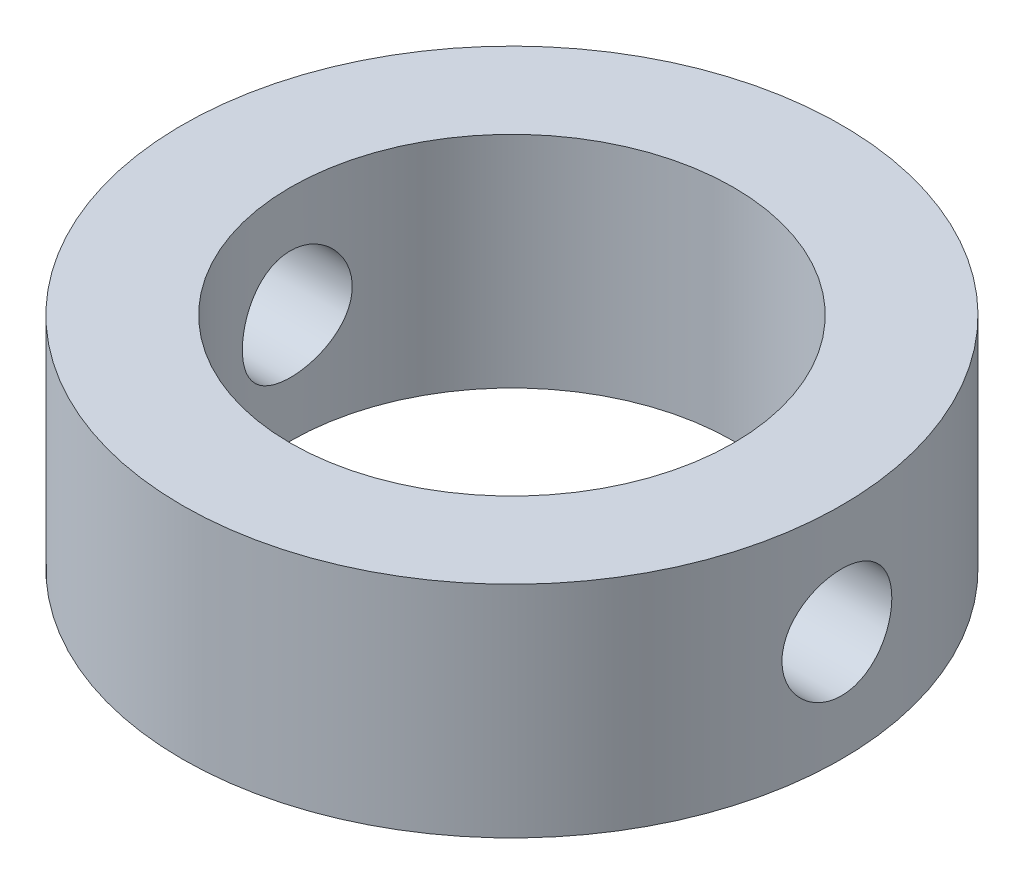
ISO-10303-21;
HEADER;
FILE_DESCRIPTION(('STEP AP214'),'2;1');
FILE_NAME('part.step','',(''),(''),'','','');
FILE_SCHEMA(('AUTOMOTIVE_DESIGN { 1 0 10303 214 1 1 1 1 }'));
ENDSEC;
DATA;
#1=APPLICATION_CONTEXT('core data for automotive mechanical design processes');
#2=APPLICATION_PROTOCOL_DEFINITION('international standard','automotive_design',2000,#1);
#3=PRODUCT_CONTEXT('',#1,'mechanical');
#4=PRODUCT('Part','Part','',(#3));
#5=PRODUCT_RELATED_PRODUCT_CATEGORY('part','',(#4));
#6=PRODUCT_DEFINITION_FORMATION('','',#4);
#7=PRODUCT_DEFINITION_CONTEXT('part definition',#1,'design');
#8=PRODUCT_DEFINITION('design','',#6,#7);
#9=PRODUCT_DEFINITION_SHAPE('','',#8);
#10=(LENGTH_UNIT() NAMED_UNIT(*) SI_UNIT(.MILLI.,.METRE.));
#11=(NAMED_UNIT(*) PLANE_ANGLE_UNIT() SI_UNIT($,.RADIAN.));
#12=(NAMED_UNIT(*) SI_UNIT($,.STERADIAN.) SOLID_ANGLE_UNIT());
#13=UNCERTAINTY_MEASURE_WITH_UNIT(LENGTH_MEASURE(1.E-05),#10,'distance_accuracy_value','');
#14=(GEOMETRIC_REPRESENTATION_CONTEXT(3) GLOBAL_UNCERTAINTY_ASSIGNED_CONTEXT((#13)) GLOBAL_UNIT_ASSIGNED_CONTEXT((#10,
#11,#12)) REPRESENTATION_CONTEXT('',''));
#15=CARTESIAN_POINT('',(0.,0.,0.));
#16=DIRECTION('',(0.,0.,1.));
#17=DIRECTION('',(1.,0.,0.));
#18=AXIS2_PLACEMENT_3D('',#15,#16,#17);
#19=CARTESIAN_POINT('',(-19.0091828831705,-240.5,-53.2448828787845));
#20=DIRECTION('',(0.,-1.,0.));
#21=DIRECTION('',(0.,0.,-1.));
#22=AXIS2_PLACEMENT_3D('',#19,#20,#21);
#23=CYLINDRICAL_SURFACE('',#22,9.);
#24=CARTESIAN_POINT('',(-19.0091828831705,-240.5,-53.2448828787845));
#25=DIRECTION('',(0.,1.,0.));
#26=DIRECTION('',(0.,0.,1.));
#27=AXIS2_PLACEMENT_3D('',#24,#25,#26);
#28=CIRCLE('',#27,9.);
#29=CARTESIAN_POINT('',(-19.0091828831705,-240.5,-44.2448828787845));
#30=VERTEX_POINT('',#29);
#31=EDGE_CURVE('E10',#30,#30,#28,.T.);
#32=ORIENTED_EDGE('',*,*,#31,.F.);
#33=EDGE_LOOP('',(#32));
#34=FACE_BOUND('',#33,.T.);
#35=CARTESIAN_POINT('',(-19.0091828831705,-246.5,-53.2448828787845));
#36=DIRECTION('',(0.,1.,0.));
#37=DIRECTION('',(0.,0.,1.));
#38=AXIS2_PLACEMENT_3D('',#35,#36,#37);
#39=CIRCLE('',#38,9.);
#40=CARTESIAN_POINT('',(-19.0091828831705,-246.5,-44.2448828787845));
#41=VERTEX_POINT('',#40);
#42=EDGE_CURVE('E55',#41,#41,#39,.T.);
#43=ORIENTED_EDGE('',*,*,#42,.T.);
#44=EDGE_LOOP('',(#43));
#45=FACE_BOUND('',#44,.T.);
#46=CARTESIAN_POINT('',(-27.88330255782,-243.5,-51.7448828787845));
#47=CARTESIAN_POINT('',(-27.8833040675782,-243.416374551112,-51.7448862397319));
#48=CARTESIAN_POINT('',(-27.8844974384589,-243.332703436385,-51.7518997773621));
#49=CARTESIAN_POINT('',(-27.8891376273796,-243.167708874068,-51.7797564219392));
#50=CARTESIAN_POINT('',(-27.8925865235191,-243.08638766375,-51.8006122825987));
#51=CARTESIAN_POINT('',(-27.9013365391045,-242.928504629986,-51.8555051525842));
#52=CARTESIAN_POINT('',(-27.9066361102022,-242.8519388908,-51.8895311458258));
#53=CARTESIAN_POINT('',(-27.9184885158566,-242.705611427172,-51.9697709806503));
#54=CARTESIAN_POINT('',(-27.9250412093554,-242.635848938254,-52.0159834506835));
#55=CARTESIAN_POINT('',(-27.9387337100862,-242.504412290153,-52.1197703626047));
#56=CARTESIAN_POINT('',(-27.9458781871329,-242.442814921168,-52.1774414494251));
#57=CARTESIAN_POINT('',(-27.9599077671873,-242.330124015883,-52.3022996759672));
#58=CARTESIAN_POINT('',(-27.9667928548024,-242.279031102131,-52.3694873792945));
#59=CARTESIAN_POINT('',(-27.9795773050654,-242.188511259668,-52.5119691568155));
#60=CARTESIAN_POINT('',(-27.9854705377642,-242.149155795361,-52.5873092299104));
#61=CARTESIAN_POINT('',(-27.9955553049135,-242.083687357682,-52.7436455057501));
#62=CARTESIAN_POINT('',(-27.9997469500066,-242.057573523269,-52.8246413403376));
#63=CARTESIAN_POINT('',(-28.0059232915168,-242.01956447901,-52.9891966429779));
#64=CARTESIAN_POINT('',(-28.007928001836,-242.007540250397,-53.0727255467769));
#65=CARTESIAN_POINT('',(-28.0095733592272,-241.997650547508,-53.240637707469));
#66=CARTESIAN_POINT('',(-28.0092141669864,-241.999784110852,-53.3250209059018));
#67=CARTESIAN_POINT('',(-28.0061880337589,-242.018048810917,-53.4913641898318));
#68=CARTESIAN_POINT('',(-28.0035439853249,-242.034041098045,-53.5733399972046));
#69=CARTESIAN_POINT('',(-27.9962707558004,-242.079350644548,-53.7334280665515));
#70=CARTESIAN_POINT('',(-27.9916415142498,-242.108668309754,-53.8115402107754));
#71=CARTESIAN_POINT('',(-27.9808790742423,-242.179934384189,-53.962096567454));
#72=CARTESIAN_POINT('',(-27.9747390871318,-242.221940007249,-54.0345131925959));
#73=CARTESIAN_POINT('',(-27.9616373115995,-242.317347693581,-54.1713221966925));
#74=CARTESIAN_POINT('',(-27.9546754566853,-242.370750679226,-54.235713925534));
#75=CARTESIAN_POINT('',(-27.9406044925661,-242.488207283972,-54.3554656428525));
#76=CARTESIAN_POINT('',(-27.9334946215568,-242.552382256941,-54.4107065801364));
#77=CARTESIAN_POINT('',(-27.9200106418794,-242.689152254129,-54.5096556318533));
#78=CARTESIAN_POINT('',(-27.9136365399985,-242.76174735601,-54.5533636399039));
#79=CARTESIAN_POINT('',(-27.9023454105414,-242.913434985126,-54.6280295394775));
#80=CARTESIAN_POINT('',(-27.8974300229861,-242.992534698855,-54.658973095152));
#81=CARTESIAN_POINT('',(-27.8896400153098,-243.154909443385,-54.7071008012739));
#82=CARTESIAN_POINT('',(-27.8867652155005,-243.238184105859,-54.7242861632452));
#83=CARTESIAN_POINT('',(-27.8834166397032,-243.405479693697,-54.744242009712));
#84=CARTESIAN_POINT('',(-27.8829145977225,-243.489479827821,-54.7471822035319));
#85=CARTESIAN_POINT('',(-27.8842930918647,-243.656772003015,-54.739016500394));
#86=CARTESIAN_POINT('',(-27.8861735359617,-243.740064071308,-54.7279111459593));
#87=CARTESIAN_POINT('',(-27.8920790079006,-243.903036655514,-54.6921142797413));
#88=CARTESIAN_POINT('',(-27.8960903946806,-243.982736683927,-54.6675091531723));
#89=CARTESIAN_POINT('',(-27.9057943212035,-244.136882099768,-54.6055017928999));
#90=CARTESIAN_POINT('',(-27.911486961514,-244.211327172531,-54.568098793645));
#91=CARTESIAN_POINT('',(-27.9239776535549,-244.353604756644,-54.481156882722));
#92=CARTESIAN_POINT('',(-27.9307854167726,-244.421369943654,-54.4315092172801));
#93=CARTESIAN_POINT('',(-27.9447108832497,-244.547668119617,-54.3216365582093));
#94=CARTESIAN_POINT('',(-27.9518286082825,-244.606200458666,-54.2614108206149));
#95=CARTESIAN_POINT('',(-27.9656614158801,-244.712991135637,-54.1313397209818));
#96=CARTESIAN_POINT('',(-27.9723715412386,-244.761136295771,-54.0614008308162));
#97=CARTESIAN_POINT('',(-27.9845535577682,-244.844993196203,-53.9143289475541));
#98=CARTESIAN_POINT('',(-27.9900254889904,-244.880705338684,-53.8371961872668));
#99=CARTESIAN_POINT('',(-27.999093032188,-244.938506350373,-53.6782623096853));
#100=CARTESIAN_POINT('',(-28.0026967905763,-244.960654445441,-53.596483216346));
#101=CARTESIAN_POINT('',(-28.0076563821862,-244.990889359378,-53.430301319709));
#102=CARTESIAN_POINT('',(-28.0090124003716,-244.998977335239,-53.3458987328775));
#103=CARTESIAN_POINT('',(-28.0093211104975,-245.000829129387,-53.1779581133203));
#104=CARTESIAN_POINT('',(-28.008302695316,-244.994765152365,-53.0944219824229));
#105=CARTESIAN_POINT('',(-28.0040359534942,-244.968857646638,-52.9295756941957));
#106=CARTESIAN_POINT('',(-28.0007876393405,-244.949014195094,-52.848265524404));
#107=CARTESIAN_POINT('',(-27.992424816136,-244.896177100674,-52.6902450112333));
#108=CARTESIAN_POINT('',(-27.9873123854199,-244.863198099074,-52.6135296554921));
#109=CARTESIAN_POINT('',(-27.9757794244346,-244.785045238262,-52.4666946069953));
#110=CARTESIAN_POINT('',(-27.9693588321598,-244.739870800963,-52.396575227114));
#111=CARTESIAN_POINT('',(-27.9558286608844,-244.637998944523,-52.2640551114682));
#112=CARTESIAN_POINT('',(-27.9487120304749,-244.581175427146,-52.2017520204211));
#113=CARTESIAN_POINT('',(-27.9346407029991,-244.457883015261,-52.0875045532157));
#114=CARTESIAN_POINT('',(-27.9276860442522,-244.391411864665,-52.0355626067638));
#115=CARTESIAN_POINT('',(-27.9146729445911,-244.250152806495,-51.9431743162327));
#116=CARTESIAN_POINT('',(-27.9086211910579,-244.175309396097,-51.9028118853277));
#117=CARTESIAN_POINT('',(-27.8981781445012,-244.019834458453,-51.8352941569199));
#118=CARTESIAN_POINT('',(-27.8937851936782,-243.939208806382,-51.8081256656455));
#119=CARTESIAN_POINT('',(-27.8881313521972,-243.798557738314,-51.7736672469112));
#120=CARTESIAN_POINT('',(-27.8863306236966,-243.739383915225,-51.7628904281823));
#121=CARTESIAN_POINT('',(-27.8839156948897,-243.620147909095,-51.748497101675));
#122=CARTESIAN_POINT('',(-27.8833014730432,-243.560085742202,-51.7448804639093));
#123=CARTESIAN_POINT('',(-27.88330255782,-243.5,-51.7448828787845));
#124=B_SPLINE_CURVE_WITH_KNOTS('',3,(#46,#47,#48,#49,#50,#51,#52,#53,#54,#55,#56,#57,#58,#59,
#60,#61,#62,#63,#64,#65,#66,#67,#68,#69,#70,#71,#72,#73,#74,#75,#76,#77,#78,#79,#80,#81,#82,#83,
#84,#85,#86,#87,#88,#89,#90,#91,#92,#93,#94,#95,#96,#97,#98,#99,#100,#101,#102,#103,#104,#105,
#106,#107,#108,#109,#110,#111,#112,#113,#114,#115,#116,#117,#118,#119,#120,#121,#122,#123),
.UNSPECIFIED.,.T.,.F.,(4,2,2,2,2,2,2,2,2,2,2,2,2,2,2,2,2,2,2,2,2,2,2,2,2,2,2,2,2,2,2,2,2,2,2,2,
2,2,4),(0.,0.250656623343192,0.501544511951658,0.752222998699012,1.00287328440552,
1.25573495490815,1.50861160698055,1.76299788064248,2.01736761064056,2.26938940480927,
2.52139406789003,2.77090272696189,3.02041898547107,3.27107762481041,3.52175655733445,
3.77547674074664,4.02919926445002,4.28320597496554,4.53719031560234,4.78814125449636,
5.03908250045774,5.28843638778681,5.53780519373534,5.78947405655009,6.04116062655803,
6.2954646781862,6.54976050283409,6.80293790647976,7.05609447544799,7.30618665756938,
7.55627743928682,7.80609023896861,8.05591488232788,8.30860198475336,8.56134827326476,
8.81588236567714,9.07016140042579,9.25026402322163,9.43036337636996),.UNSPECIFIED.);
#125=CARTESIAN_POINT('',(-27.88330255782,-243.5,-51.7448828787845));
#126=VERTEX_POINT('',#125);
#127=EDGE_CURVE('E85',#126,#126,#124,.T.);
#128=ORIENTED_EDGE('',*,*,#127,.F.);
#129=EDGE_LOOP('',(#128));
#130=FACE_BOUND('',#129,.T.);
#131=CARTESIAN_POINT('',(-10.1350632085211,-243.5,-51.7448828787845));
#132=CARTESIAN_POINT('',(-10.1350616987629,-243.583625448888,-51.7448862397319));
#133=CARTESIAN_POINT('',(-10.1338683278821,-243.667296563615,-51.7518997773621));
#134=CARTESIAN_POINT('',(-10.1292281389615,-243.832291125932,-51.7797564219392));
#135=CARTESIAN_POINT('',(-10.125779242822,-243.91361233625,-51.8006122825987));
#136=CARTESIAN_POINT('',(-10.1170292272366,-244.071495370014,-51.8555051525842));
#137=CARTESIAN_POINT('',(-10.1117296561388,-244.1480611092,-51.8895311458258));
#138=CARTESIAN_POINT('',(-10.0998772504845,-244.294388572828,-51.9697709806503));
#139=CARTESIAN_POINT('',(-10.0933245569857,-244.364151061746,-52.0159834506835));
#140=CARTESIAN_POINT('',(-10.0796320562549,-244.495587709847,-52.1197703626047));
#141=CARTESIAN_POINT('',(-10.0724875792081,-244.557185078832,-52.1774414494251));
#142=CARTESIAN_POINT('',(-10.0584579991538,-244.669875984117,-52.3022996759673));
#143=CARTESIAN_POINT('',(-10.0515729115387,-244.720968897869,-52.3694873792945));
#144=CARTESIAN_POINT('',(-10.0387884612757,-244.811488740332,-52.5119691568155));
#145=CARTESIAN_POINT('',(-10.0328952285769,-244.850844204639,-52.5873092299105));
#146=CARTESIAN_POINT('',(-10.0228104614276,-244.916312642318,-52.7436455057502));
#147=CARTESIAN_POINT('',(-10.0186188163345,-244.942426476731,-52.8246413403376));
#148=CARTESIAN_POINT('',(-10.0124424748243,-244.98043552099,-52.9891966429779));
#149=CARTESIAN_POINT('',(-10.0104377645051,-244.992459749603,-53.0727255467769));
#150=CARTESIAN_POINT('',(-10.0087924071138,-245.002349452492,-53.240637707469));
#151=CARTESIAN_POINT('',(-10.0091515993547,-245.000215889148,-53.3250209059018));
#152=CARTESIAN_POINT('',(-10.0121777325822,-244.981951189083,-53.4913641898318));
#153=CARTESIAN_POINT('',(-10.0148217810161,-244.965958901955,-53.5733399972046));
#154=CARTESIAN_POINT('',(-10.0220950105407,-244.920649355452,-53.7334280665515));
#155=CARTESIAN_POINT('',(-10.0267242520913,-244.891331690246,-53.8115402107754));
#156=CARTESIAN_POINT('',(-10.0374866920988,-244.820065615811,-53.962096567454));
#157=CARTESIAN_POINT('',(-10.0436266792093,-244.778059992751,-54.0345131925959));
#158=CARTESIAN_POINT('',(-10.0567284547415,-244.682652306419,-54.1713221966925));
#159=CARTESIAN_POINT('',(-10.0636903096557,-244.629249320774,-54.235713925534));
#160=CARTESIAN_POINT('',(-10.077761273775,-244.511792716028,-54.3554656428525));
#161=CARTESIAN_POINT('',(-10.0848711447843,-244.447617743059,-54.4107065801364));
#162=CARTESIAN_POINT('',(-10.0983551244617,-244.31084774587,-54.5096556318533));
#163=CARTESIAN_POINT('',(-10.1047292263426,-244.23825264399,-54.5533636399039));
#164=CARTESIAN_POINT('',(-10.1160203557996,-244.086565014873,-54.6280295394775));
#165=CARTESIAN_POINT('',(-10.1209357433549,-244.007465301145,-54.658973095152));
#166=CARTESIAN_POINT('',(-10.1287257510313,-243.845090556615,-54.7071008012739));
#167=CARTESIAN_POINT('',(-10.1316005508406,-243.761815894141,-54.7242861632452));
#168=CARTESIAN_POINT('',(-10.1349491266378,-243.594520306303,-54.744242009712));
#169=CARTESIAN_POINT('',(-10.1354511686185,-243.510520172179,-54.7471822035319));
#170=CARTESIAN_POINT('',(-10.1340726744764,-243.343227996985,-54.739016500394));
#171=CARTESIAN_POINT('',(-10.1321922303794,-243.259935928692,-54.7279111459593));
#172=CARTESIAN_POINT('',(-10.1262867584404,-243.096963344485,-54.6921142797413));
#173=CARTESIAN_POINT('',(-10.1222753716604,-243.017263316073,-54.6675091531723));
#174=CARTESIAN_POINT('',(-10.1125714451375,-242.863117900232,-54.6055017928999));
#175=CARTESIAN_POINT('',(-10.1068788048271,-242.788672827469,-54.568098793645));
#176=CARTESIAN_POINT('',(-10.0943881127862,-242.646395243356,-54.481156882722));
#177=CARTESIAN_POINT('',(-10.0875803495684,-242.578630056346,-54.4315092172801));
#178=CARTESIAN_POINT('',(-10.0736548830913,-242.452331880383,-54.3216365582093));
#179=CARTESIAN_POINT('',(-10.0665371580585,-242.393799541334,-54.2614108206149));
#180=CARTESIAN_POINT('',(-10.0527043504609,-242.287008864363,-54.1313397209818));
#181=CARTESIAN_POINT('',(-10.0459942251025,-242.238863704229,-54.0614008308162));
#182=CARTESIAN_POINT('',(-10.0338122085729,-242.155006803797,-53.9143289475541));
#183=CARTESIAN_POINT('',(-10.0283402773507,-242.119294661316,-53.8371961872668));
#184=CARTESIAN_POINT('',(-10.019272734153,-242.061493649627,-53.6782623096853));
#185=CARTESIAN_POINT('',(-10.0156689757648,-242.039345554559,-53.596483216346));
#186=CARTESIAN_POINT('',(-10.0107093841548,-242.009110640622,-53.430301319709));
#187=CARTESIAN_POINT('',(-10.0093533659695,-242.001022664761,-53.3458987328775));
#188=CARTESIAN_POINT('',(-10.0090446558436,-241.999170870613,-53.1779581133203));
#189=CARTESIAN_POINT('',(-10.0100630710251,-242.005234847635,-53.0944219824229));
#190=CARTESIAN_POINT('',(-10.0143298128468,-242.031142353362,-52.9295756941957));
#191=CARTESIAN_POINT('',(-10.0175781270005,-242.050985804906,-52.848265524404));
#192=CARTESIAN_POINT('',(-10.025940950205,-242.103822899326,-52.6902450112333));
#193=CARTESIAN_POINT('',(-10.0310533809212,-242.136801900926,-52.6135296554921));
#194=CARTESIAN_POINT('',(-10.0425863419064,-242.214954761738,-52.4666946069953));
#195=CARTESIAN_POINT('',(-10.0490069341812,-242.260129199037,-52.396575227114));
#196=CARTESIAN_POINT('',(-10.0625371054567,-242.362001055477,-52.2640551114682));
#197=CARTESIAN_POINT('',(-10.0696537358661,-242.418824572854,-52.2017520204211));
#198=CARTESIAN_POINT('',(-10.083725063342,-242.542116984739,-52.0875045532156));
#199=CARTESIAN_POINT('',(-10.0906797220889,-242.608588135335,-52.0355626067638));
#200=CARTESIAN_POINT('',(-10.1036928217499,-242.749847193505,-51.9431743162327));
#201=CARTESIAN_POINT('',(-10.1097445752831,-242.824690603903,-51.9028118853278));
#202=CARTESIAN_POINT('',(-10.1201876218399,-242.980165541547,-51.8352941569199));
#203=CARTESIAN_POINT('',(-10.1245805726629,-243.060791193618,-51.8081256656455));
#204=CARTESIAN_POINT('',(-10.1302344141439,-243.201442261686,-51.7736672469112));
#205=CARTESIAN_POINT('',(-10.1320351426444,-243.260616084775,-51.7628904281823));
#206=CARTESIAN_POINT('',(-10.1344500714514,-243.379852090905,-51.748497101675));
#207=CARTESIAN_POINT('',(-10.1350642932979,-243.439914257798,-51.7448804639093));
#208=CARTESIAN_POINT('',(-10.1350632085211,-243.5,-51.7448828787845));
#209=B_SPLINE_CURVE_WITH_KNOTS('',3,(#131,#132,#133,#134,#135,#136,#137,#138,#139,#140,#141,
#142,#143,#144,#145,#146,#147,#148,#149,#150,#151,#152,#153,#154,#155,#156,#157,#158,#159,#160,
#161,#162,#163,#164,#165,#166,#167,#168,#169,#170,#171,#172,#173,#174,#175,#176,#177,#178,#179,
#180,#181,#182,#183,#184,#185,#186,#187,#188,#189,#190,#191,#192,#193,#194,#195,#196,#197,#198,
#199,#200,#201,#202,#203,#204,#205,#206,#207,#208),.UNSPECIFIED.,.T.,.F.,(4,2,2,2,2,2,2,2,2,2,2,
2,2,2,2,2,2,2,2,2,2,2,2,2,2,2,2,2,2,2,2,2,2,2,2,2,2,2,4),(0.,0.250656623343192,
0.501544511951658,0.752222998699012,1.00287328440552,1.25573495490816,1.50861160698055,
1.7629978806425,2.01736761064056,2.26938940480927,2.52139406789003,2.77090272696189,
3.02041898547107,3.27107762481041,3.52175655733445,3.77547674074664,4.02919926445001,
4.28320597496554,4.53719031560234,4.78814125449636,5.03908250045774,5.2884363877868,
5.53780519373534,5.78947405655009,6.04116062655802,6.2954646781862,6.54976050283409,
6.80293790647976,7.05609447544798,7.30618665756938,7.55627743928682,7.80609023896862,
8.05591488232788,8.3086019847534,8.56134827326476,8.81588236567713,9.07016140042578,
9.25026402322163,9.43036337636995),.UNSPECIFIED.);
#210=CARTESIAN_POINT('',(-10.1350632085211,-243.5,-51.7448828787845));
#211=VERTEX_POINT('',#210);
#212=EDGE_CURVE('E62',#211,#211,#209,.T.);
#213=ORIENTED_EDGE('',*,*,#212,.F.);
#214=EDGE_LOOP('',(#213));
#215=FACE_BOUND('',#214,.T.);
#216=ADVANCED_FACE('F39',(#34,#45,#130,#215),#23,.T.);
#217=CARTESIAN_POINT('',(-19.0091828831705,-240.4,-53.2448828787845));
#218=DIRECTION('',(0.,-1.,0.));
#219=DIRECTION('',(0.,0.,-1.));
#220=AXIS2_PLACEMENT_3D('',#217,#218,#219);
#221=CYLINDRICAL_SURFACE('',#220,6.05);
#222=CARTESIAN_POINT('',(-24.8702834624133,-243.5,-51.7448828787845));
#223=CARTESIAN_POINT('',(-24.8702850568459,-243.417145871372,-51.7448852714866));
#224=CARTESIAN_POINT('',(-24.8720595174571,-243.33426511614,-51.7517710666074));
#225=CARTESIAN_POINT('',(-24.8789478656689,-243.170882052661,-51.7790893724568));
#226=CARTESIAN_POINT('',(-24.8840637292599,-243.090381181258,-51.7995298990955));
#227=CARTESIAN_POINT('',(-24.8970206697318,-242.934144766549,-51.8532567636231));
#228=CARTESIAN_POINT('',(-24.9048582645577,-242.858403279826,-51.886526694153));
#229=CARTESIAN_POINT('',(-24.9223712447743,-242.713569094319,-51.9649181769439));
#230=CARTESIAN_POINT('',(-24.9320467002792,-242.644476649346,-52.0100401813859));
#231=CARTESIAN_POINT('',(-24.9523796561404,-242.513406159432,-52.1118981320343));
#232=CARTESIAN_POINT('',(-24.9630526354277,-242.451593249911,-52.168843525269));
#233=CARTESIAN_POINT('',(-24.9840437016995,-242.338290682976,-52.2922805759095));
#234=CARTESIAN_POINT('',(-24.9943617558478,-242.286801978596,-52.3587731136471));
#235=CARTESIAN_POINT('',(-25.0136514801466,-242.194935328621,-52.500546607136));
#236=CARTESIAN_POINT('',(-25.0226027540224,-242.154719373618,-52.5759355450226));
#237=CARTESIAN_POINT('',(-25.0379738821197,-242.087592712703,-52.7326624126282));
#238=CARTESIAN_POINT('',(-25.0443941034728,-242.060680076987,-52.8139994775348));
#239=CARTESIAN_POINT('',(-25.0538703190283,-242.021452276688,-52.978592482665));
#240=CARTESIAN_POINT('',(-25.0569908413507,-242.008856747212,-53.0617778237047));
#241=CARTESIAN_POINT('',(-25.0597408348001,-241.997740893098,-53.2291354417412));
#242=CARTESIAN_POINT('',(-25.0593708139073,-241.999218520387,-53.3133075733494));
#243=CARTESIAN_POINT('',(-25.0552295363811,-242.016004889703,-53.478305767371));
#244=CARTESIAN_POINT('',(-25.0515326948305,-242.031011035916,-53.5591647633216));
#245=CARTESIAN_POINT('',(-25.0412396704779,-242.073942381363,-53.7171792065156));
#246=CARTESIAN_POINT('',(-25.0346433347749,-242.101868261907,-53.7943344582088));
#247=CARTESIAN_POINT('',(-25.0191782452565,-242.170092763352,-53.9435514464938));
#248=CARTESIAN_POINT('',(-25.0102897408778,-242.210499557116,-54.015561593629));
#249=CARTESIAN_POINT('',(-24.9912052260717,-242.302456929857,-54.1518854701365));
#250=CARTESIAN_POINT('',(-24.9810089916444,-242.354009419009,-54.2161978773138));
#251=CARTESIAN_POINT('',(-24.9601004734071,-242.468418739372,-54.3371050379952));
#252=CARTESIAN_POINT('',(-24.9493816778842,-242.531540031227,-54.3934486825601));
#253=CARTESIAN_POINT('',(-24.9288849641037,-242.666447544473,-54.4948064376446));
#254=CARTESIAN_POINT('',(-24.9191070883614,-242.738234157074,-54.5398200363668));
#255=CARTESIAN_POINT('',(-24.9015763700652,-242.888921008808,-54.6173971643501));
#256=CARTESIAN_POINT('',(-24.8938332649706,-242.967853107807,-54.6499011607648));
#257=CARTESIAN_POINT('',(-24.8813742843728,-243.130299513716,-54.7011005722889));
#258=CARTESIAN_POINT('',(-24.8766577731665,-243.213812854385,-54.7197988872556));
#259=CARTESIAN_POINT('',(-24.8709191734455,-243.38072474514,-54.7424414489509));
#260=CARTESIAN_POINT('',(-24.8698042388138,-243.464069849902,-54.7467565794362));
#261=CARTESIAN_POINT('',(-24.8711424584858,-243.630289310283,-54.7415248691219));
#262=CARTESIAN_POINT('',(-24.8735952903387,-243.713163707763,-54.7319792810398));
#263=CARTESIAN_POINT('',(-24.8817037901151,-243.874718130252,-54.6996220670496));
#264=CARTESIAN_POINT('',(-24.8873074853785,-243.953444096,-54.6770255523593));
#265=CARTESIAN_POINT('',(-24.9010371444395,-244.105990866611,-54.6194460252897));
#266=CARTESIAN_POINT('',(-24.9091634032059,-244.179811096609,-54.5844615642934));
#267=CARTESIAN_POINT('',(-24.9272186395328,-244.322024713169,-54.5023201124649));
#268=CARTESIAN_POINT('',(-24.9371794257557,-244.39028562448,-54.4549409096159));
#269=CARTESIAN_POINT('',(-24.9577029518504,-244.518024313333,-54.3496365426515));
#270=CARTESIAN_POINT('',(-24.9682657887546,-244.577500669491,-54.2917096752495));
#271=CARTESIAN_POINT('',(-24.989117316607,-244.687479914155,-54.1652538364561));
#272=CARTESIAN_POINT('',(-24.9993928998793,-244.737726490308,-54.0964993870566));
#273=CARTESIAN_POINT('',(-25.0182432675438,-244.825960338467,-53.9513131747291));
#274=CARTESIAN_POINT('',(-25.0268181402405,-244.863948247033,-53.8748818107134));
#275=CARTESIAN_POINT('',(-25.0412471368977,-244.926259322716,-53.7170373492165));
#276=CARTESIAN_POINT('',(-25.0471206544415,-244.950680162875,-53.6356646657471));
#277=CARTESIAN_POINT('',(-25.055569989341,-244.985458073156,-53.469805777597));
#278=CARTESIAN_POINT('',(-25.0581464319434,-244.995817809803,-53.385320166369));
#279=CARTESIAN_POINT('',(-25.0596862845965,-245.002031514408,-53.2180432793975));
#280=CARTESIAN_POINT('',(-25.0587439852062,-244.998264033302,-53.1352667185128));
#281=CARTESIAN_POINT('',(-25.0535608306931,-244.977195886485,-52.9715652774665));
#282=CARTESIAN_POINT('',(-25.0493200707326,-244.959895611202,-52.890640343954));
#283=CARTESIAN_POINT('',(-25.0380305583394,-244.912454589756,-52.7333283883995));
#284=CARTESIAN_POINT('',(-25.0309965652214,-244.882381278526,-52.6569199016116));
#285=CARTESIAN_POINT('',(-25.0148619656469,-244.810309234355,-52.5101902687428));
#286=CARTESIAN_POINT('',(-25.0057611024955,-244.768309019989,-52.4398698802725));
#287=CARTESIAN_POINT('',(-24.9862062239836,-244.672415313698,-52.3055139125641));
#288=CARTESIAN_POINT('',(-24.9757253218841,-244.618264305729,-52.2416660406226));
#289=CARTESIAN_POINT('',(-24.9547141160229,-244.500107510859,-52.1238349388713));
#290=CARTESIAN_POINT('',(-24.9441838004572,-244.436099239464,-52.0698542035653));
#291=CARTESIAN_POINT('',(-24.9240473496045,-244.298637306859,-51.9723226509854));
#292=CARTESIAN_POINT('',(-24.9144616117148,-244.225032456485,-51.9289803847085));
#293=CARTESIAN_POINT('',(-24.8975727325172,-244.071354258327,-51.855349825805));
#294=CARTESIAN_POINT('',(-24.8902679119987,-243.991285724021,-51.8250519236661));
#295=CARTESIAN_POINT('',(-24.879924526445,-243.84278419005,-51.7829446986912));
#296=CARTESIAN_POINT('',(-24.876336100783,-243.775069134371,-51.768702355673));
#297=CARTESIAN_POINT('',(-24.8715150004875,-243.638242154339,-51.7496708363202));
#298=CARTESIAN_POINT('',(-24.8702821320792,-243.569130345359,-51.7448808824045));
#299=CARTESIAN_POINT('',(-24.8702834624133,-243.5,-51.7448828787845));
#300=B_SPLINE_CURVE_WITH_KNOTS('',3,(#222,#223,#224,#225,#226,#227,#228,#229,#230,#231,#232,
#233,#234,#235,#236,#237,#238,#239,#240,#241,#242,#243,#244,#245,#246,#247,#248,#249,#250,#251,
#252,#253,#254,#255,#256,#257,#258,#259,#260,#261,#262,#263,#264,#265,#266,#267,#268,#269,#270,
#271,#272,#273,#274,#275,#276,#277,#278,#279,#280,#281,#282,#283,#284,#285,#286,#287,#288,#289,
#290,#291,#292,#293,#294,#295,#296,#297,#298,#299),.UNSPECIFIED.,.T.,.F.,(4,2,2,2,2,2,2,2,2,2,2,
2,2,2,2,2,2,2,2,2,2,2,2,2,2,2,2,2,2,2,2,2,2,2,2,2,2,2,4),(0.,0.248308555378134,
0.496764084985488,0.744902916217029,0.993051215830481,1.24604175182046,1.49905563079247,
1.75553800799939,2.01198316847503,2.26331496642089,2.51461018850564,2.76042038788378,
3.00624355129861,3.2542600780021,3.50231914408441,3.75698358308597,4.01165952364874,
4.26753289950168,4.52335251433646,4.77252234046925,5.0216696482933,5.2668230552269,
5.51200513928916,5.7619263419736,6.01188793896213,6.26798960627749,6.52407797276706,
6.7782979723238,7.0324697552718,7.27988006564557,7.5272832383672,7.77339617740616,
8.01953969916324,8.27149784954302,8.52351960945304,8.78014536003372,9.03658173491866,
9.2437780297213,9.450957279243),.UNSPECIFIED.);
#301=CARTESIAN_POINT('',(-24.8702834624133,-243.5,-51.7448828787845));
#302=VERTEX_POINT('',#301);
#303=EDGE_CURVE('E64',#302,#302,#300,.T.);
#304=ORIENTED_EDGE('',*,*,#303,.T.);
#305=EDGE_LOOP('',(#304));
#306=FACE_BOUND('',#305,.T.);
#307=CARTESIAN_POINT('',(-19.0091828831705,-240.5,-53.2448828787845));
#308=DIRECTION('',(0.,1.,0.));
#309=DIRECTION('',(0.,0.,1.));
#310=AXIS2_PLACEMENT_3D('',#307,#308,#309);
#311=CIRCLE('',#310,6.05);
#312=CARTESIAN_POINT('',(-19.0091828831705,-240.5,-47.1948828787845));
#313=VERTEX_POINT('',#312);
#314=EDGE_CURVE('E60',#313,#313,#311,.F.);
#315=ORIENTED_EDGE('',*,*,#314,.F.);
#316=EDGE_LOOP('',(#315));
#317=FACE_BOUND('',#316,.T.);
#318=CARTESIAN_POINT('',(-19.0091828831705,-246.5,-53.2448828787845));
#319=DIRECTION('',(0.,1.,0.));
#320=DIRECTION('',(0.,0.,1.));
#321=AXIS2_PLACEMENT_3D('',#318,#319,#320);
#322=CIRCLE('',#321,6.05);
#323=CARTESIAN_POINT('',(-19.0091828831705,-246.5,-47.1948828787845));
#324=VERTEX_POINT('',#323);
#325=EDGE_CURVE('E65',#324,#324,#322,.F.);
#326=ORIENTED_EDGE('',*,*,#325,.T.);
#327=EDGE_LOOP('',(#326));
#328=FACE_BOUND('',#327,.T.);
#329=CARTESIAN_POINT('',(-13.1480823039278,-243.5,-51.7448828787845));
#330=CARTESIAN_POINT('',(-13.1480807094952,-243.582854128628,-51.7448852714866));
#331=CARTESIAN_POINT('',(-13.146306248884,-243.66573488386,-51.7517710666074));
#332=CARTESIAN_POINT('',(-13.1394179006722,-243.829117947339,-51.7790893724568));
#333=CARTESIAN_POINT('',(-13.1343020370812,-243.909618818742,-51.7995298990955));
#334=CARTESIAN_POINT('',(-13.1213450966092,-244.065855233451,-51.8532567636231));
#335=CARTESIAN_POINT('',(-13.1135075017833,-244.141596720174,-51.886526694153));
#336=CARTESIAN_POINT('',(-13.0959945215668,-244.286430905681,-51.9649181769439));
#337=CARTESIAN_POINT('',(-13.0863190660618,-244.355523350654,-52.0100401813859));
#338=CARTESIAN_POINT('',(-13.0659861102007,-244.486593840568,-52.1118981320343));
#339=CARTESIAN_POINT('',(-13.0553131309134,-244.548406750089,-52.168843525269));
#340=CARTESIAN_POINT('',(-13.0343220646416,-244.661709317024,-52.2922805759095));
#341=CARTESIAN_POINT('',(-13.0240040104932,-244.713198021404,-52.3587731136471));
#342=CARTESIAN_POINT('',(-13.0047142861945,-244.805064671379,-52.500546607136));
#343=CARTESIAN_POINT('',(-12.9957630123186,-244.845280626382,-52.5759355450226));
#344=CARTESIAN_POINT('',(-12.9803918842214,-244.912407287297,-52.7326624126282));
#345=CARTESIAN_POINT('',(-12.9739716628683,-244.939319923013,-52.8139994775348));
#346=CARTESIAN_POINT('',(-12.9644954473128,-244.978547723312,-52.978592482665));
#347=CARTESIAN_POINT('',(-12.9613749249903,-244.991143252788,-53.0617778237047));
#348=CARTESIAN_POINT('',(-12.9586249315409,-245.002259106902,-53.2291354417412));
#349=CARTESIAN_POINT('',(-12.9589949524337,-245.000781479613,-53.3133075733494));
#350=CARTESIAN_POINT('',(-12.96313622996,-244.983995110297,-53.478305767371));
#351=CARTESIAN_POINT('',(-12.9668330715105,-244.968988964084,-53.5591647633216));
#352=CARTESIAN_POINT('',(-12.9771260958631,-244.926057618637,-53.7171792065156));
#353=CARTESIAN_POINT('',(-12.9837224315662,-244.898131738093,-53.7943344582088));
#354=CARTESIAN_POINT('',(-12.9991875210846,-244.829907236648,-53.9435514464938));
#355=CARTESIAN_POINT('',(-13.0080760254632,-244.789500442884,-54.015561593629));
#356=CARTESIAN_POINT('',(-13.0271605402694,-244.697543070143,-54.1518854701365));
#357=CARTESIAN_POINT('',(-13.0373567746967,-244.645990580991,-54.2161978773138));
#358=CARTESIAN_POINT('',(-13.058265292934,-244.531581260628,-54.3371050379952));
#359=CARTESIAN_POINT('',(-13.0689840884569,-244.468459968773,-54.3934486825601));
#360=CARTESIAN_POINT('',(-13.0894808022373,-244.333552455527,-54.4948064376446));
#361=CARTESIAN_POINT('',(-13.0992586779796,-244.261765842926,-54.5398200363668));
#362=CARTESIAN_POINT('',(-13.1167893962759,-244.111078991192,-54.6173971643501));
#363=CARTESIAN_POINT('',(-13.1245325013705,-244.032146892193,-54.6499011607648));
#364=CARTESIAN_POINT('',(-13.1369914819683,-243.869700486284,-54.7011005722889));
#365=CARTESIAN_POINT('',(-13.1417079931746,-243.786187145615,-54.7197988872556));
#366=CARTESIAN_POINT('',(-13.1474465928955,-243.61927525486,-54.7424414489509));
#367=CARTESIAN_POINT('',(-13.1485615275273,-243.535930150098,-54.7467565794362));
#368=CARTESIAN_POINT('',(-13.1472233078552,-243.369710689717,-54.7415248691219));
#369=CARTESIAN_POINT('',(-13.1447704760023,-243.286836292237,-54.7319792810398));
#370=CARTESIAN_POINT('',(-13.136661976226,-243.125281869748,-54.6996220670496));
#371=CARTESIAN_POINT('',(-13.1310582809626,-243.046555904,-54.6770255523593));
#372=CARTESIAN_POINT('',(-13.1173286219016,-242.894009133389,-54.6194460252897));
#373=CARTESIAN_POINT('',(-13.1092023631352,-242.820188903391,-54.5844615642934));
#374=CARTESIAN_POINT('',(-13.0911471268082,-242.677975286831,-54.5023201124649));
#375=CARTESIAN_POINT('',(-13.0811863405854,-242.60971437552,-54.4549409096159));
#376=CARTESIAN_POINT('',(-13.0606628144907,-242.481975686667,-54.3496365426515));
#377=CARTESIAN_POINT('',(-13.0500999775865,-242.422499330509,-54.2917096752495));
#378=CARTESIAN_POINT('',(-13.0292484497341,-242.312520085845,-54.1652538364561));
#379=CARTESIAN_POINT('',(-13.0189728664618,-242.262273509692,-54.0964993870566));
#380=CARTESIAN_POINT('',(-13.0001224987973,-242.174039661533,-53.9513131747291));
#381=CARTESIAN_POINT('',(-12.9915476261006,-242.136051752967,-53.8748818107134));
#382=CARTESIAN_POINT('',(-12.9771186294434,-242.073740677284,-53.7170373492165));
#383=CARTESIAN_POINT('',(-12.9712451118996,-242.049319837125,-53.6356646657471));
#384=CARTESIAN_POINT('',(-12.9627957770001,-242.014541926844,-53.469805777597));
#385=CARTESIAN_POINT('',(-12.9602193343977,-242.004182190197,-53.385320166369));
#386=CARTESIAN_POINT('',(-12.9586794817446,-241.997968485592,-53.2180432793975));
#387=CARTESIAN_POINT('',(-12.9596217811348,-242.001735966698,-53.1352667185127));
#388=CARTESIAN_POINT('',(-12.9648049356479,-242.022804113515,-52.9715652774665));
#389=CARTESIAN_POINT('',(-12.9690456956084,-242.040104388798,-52.890640343954));
#390=CARTESIAN_POINT('',(-12.9803352080017,-242.087545410244,-52.7333283883994));
#391=CARTESIAN_POINT('',(-12.9873692011196,-242.117618721474,-52.6569199016116));
#392=CARTESIAN_POINT('',(-13.0035038006941,-242.189690765645,-52.5101902687428));
#393=CARTESIAN_POINT('',(-13.0126046638455,-242.231690980011,-52.4398698802725));
#394=CARTESIAN_POINT('',(-13.0321595423575,-242.327584686302,-52.305513912564));
#395=CARTESIAN_POINT('',(-13.0426404444569,-242.381735694271,-52.2416660406226));
#396=CARTESIAN_POINT('',(-13.0636516503181,-242.499892489141,-52.1238349388713));
#397=CARTESIAN_POINT('',(-13.0741819658838,-242.563900760536,-52.0698542035653));
#398=CARTESIAN_POINT('',(-13.0943184167365,-242.701362693141,-51.9723226509854));
#399=CARTESIAN_POINT('',(-13.1039041546263,-242.774967543515,-51.9289803847084));
#400=CARTESIAN_POINT('',(-13.1207930338238,-242.928645741673,-51.855349825805));
#401=CARTESIAN_POINT('',(-13.1280978543423,-243.008714275979,-51.8250519236661));
#402=CARTESIAN_POINT('',(-13.138441239896,-243.15721580995,-51.7829446986912));
#403=CARTESIAN_POINT('',(-13.142029665558,-243.224930865629,-51.768702355673));
#404=CARTESIAN_POINT('',(-13.1468507658536,-243.361757845661,-51.7496708363202));
#405=CARTESIAN_POINT('',(-13.1480836342619,-243.430869654641,-51.7448808824045));
#406=CARTESIAN_POINT('',(-13.1480823039278,-243.5,-51.7448828787845));
#407=B_SPLINE_CURVE_WITH_KNOTS('',3,(#329,#330,#331,#332,#333,#334,#335,#336,#337,#338,#339,
#340,#341,#342,#343,#344,#345,#346,#347,#348,#349,#350,#351,#352,#353,#354,#355,#356,#357,#358,
#359,#360,#361,#362,#363,#364,#365,#366,#367,#368,#369,#370,#371,#372,#373,#374,#375,#376,#377,
#378,#379,#380,#381,#382,#383,#384,#385,#386,#387,#388,#389,#390,#391,#392,#393,#394,#395,#396,
#397,#398,#399,#400,#401,#402,#403,#404,#405,#406),.UNSPECIFIED.,.T.,.F.,(4,2,2,2,2,2,2,2,2,2,2,
2,2,2,2,2,2,2,2,2,2,2,2,2,2,2,2,2,2,2,2,2,2,2,2,2,2,2,4),(0.,0.248308555378162,
0.496764084985487,0.744902916217029,0.993051215830481,1.24604175182046,1.49905563079247,
1.75553800799939,2.01198316847503,2.26331496642089,2.51461018850564,2.76042038788378,
3.00624355129861,3.2542600780021,3.50231914408441,3.75698358308597,4.01165952364874,
4.26753289950165,4.52335251433646,4.77252234046925,5.0216696482933,5.26682305522687,
5.51200513928916,5.7619263419736,6.01188793896213,6.26798960627749,6.52407797276706,
6.7782979723238,7.03246975527181,7.27988006564557,7.52728323836721,7.77339617740618,
8.01953969916324,8.27149784954303,8.52351960945306,8.78014536003378,9.03658173491862,
9.24377802972127,9.45095727924299),.UNSPECIFIED.);
#408=CARTESIAN_POINT('',(-13.1480823039278,-243.5,-51.7448828787845));
#409=VERTEX_POINT('',#408);
#410=EDGE_CURVE('E43',#409,#409,#407,.T.);
#411=ORIENTED_EDGE('',*,*,#410,.T.);
#412=EDGE_LOOP('',(#411));
#413=FACE_BOUND('',#412,.T.);
#414=ADVANCED_FACE('F69',(#306,#317,#328,#413),#221,.F.);
#415=CARTESIAN_POINT('',(-19.0091828831705,-240.5,-53.2448828787845));
#416=DIRECTION('',(0.,1.,0.));
#417=DIRECTION('',(0.,0.,1.));
#418=AXIS2_PLACEMENT_3D('',#415,#416,#417);
#419=PLANE('',#418);
#420=ORIENTED_EDGE('',*,*,#314,.T.);
#421=EDGE_LOOP('',(#420));
#422=FACE_BOUND('',#421,.T.);
#423=ORIENTED_EDGE('',*,*,#31,.T.);
#424=EDGE_LOOP('',(#423));
#425=FACE_BOUND('',#424,.T.);
#426=ADVANCED_FACE('F99',(#422,#425),#419,.T.);
#427=CARTESIAN_POINT('',(-19.0091828831705,-246.5,-53.2448828787845));
#428=DIRECTION('',(0.,1.,0.));
#429=DIRECTION('',(0.,0.,1.));
#430=AXIS2_PLACEMENT_3D('',#427,#428,#429);
#431=PLANE('',#430);
#432=ORIENTED_EDGE('',*,*,#325,.F.);
#433=EDGE_LOOP('',(#432));
#434=FACE_BOUND('',#433,.T.);
#435=ORIENTED_EDGE('',*,*,#42,.F.);
#436=EDGE_LOOP('',(#435));
#437=FACE_BOUND('',#436,.T.);
#438=ADVANCED_FACE('F107',(#434,#437),#431,.F.);
#439=CARTESIAN_POINT('',(-9.00918288317053,-243.5,-53.2448828787845));
#440=DIRECTION('',(-1.,0.,0.));
#441=DIRECTION('',(0.,0.,1.));
#442=AXIS2_PLACEMENT_3D('',#439,#440,#441);
#443=CYLINDRICAL_SURFACE('',#442,1.5);
#444=ORIENTED_EDGE('',*,*,#303,.F.);
#445=EDGE_LOOP('',(#444));
#446=FACE_BOUND('',#445,.T.);
#447=ORIENTED_EDGE('',*,*,#127,.T.);
#448=EDGE_LOOP('',(#447));
#449=FACE_BOUND('',#448,.T.);
#450=ADVANCED_FACE('F78',(#446,#449),#443,.F.);
#451=ORIENTED_EDGE('',*,*,#410,.F.);
#452=EDGE_LOOP('',(#451));
#453=FACE_BOUND('',#452,.T.);
#454=ORIENTED_EDGE('',*,*,#212,.T.);
#455=EDGE_LOOP('',(#454));
#456=FACE_BOUND('',#455,.T.);
#457=ADVANCED_FACE('F71',(#453,#456),#443,.F.);
#458=CLOSED_SHELL('',(#216,#414,#426,#438,#450,#457));
#459=MANIFOLD_SOLID_BREP('B2',#458);
#460=ADVANCED_BREP_SHAPE_REPRESENTATION('',(#18,#459),#14);
#461=SHAPE_DEFINITION_REPRESENTATION(#9,#460);
ENDSEC;
END-ISO-10303-21;
